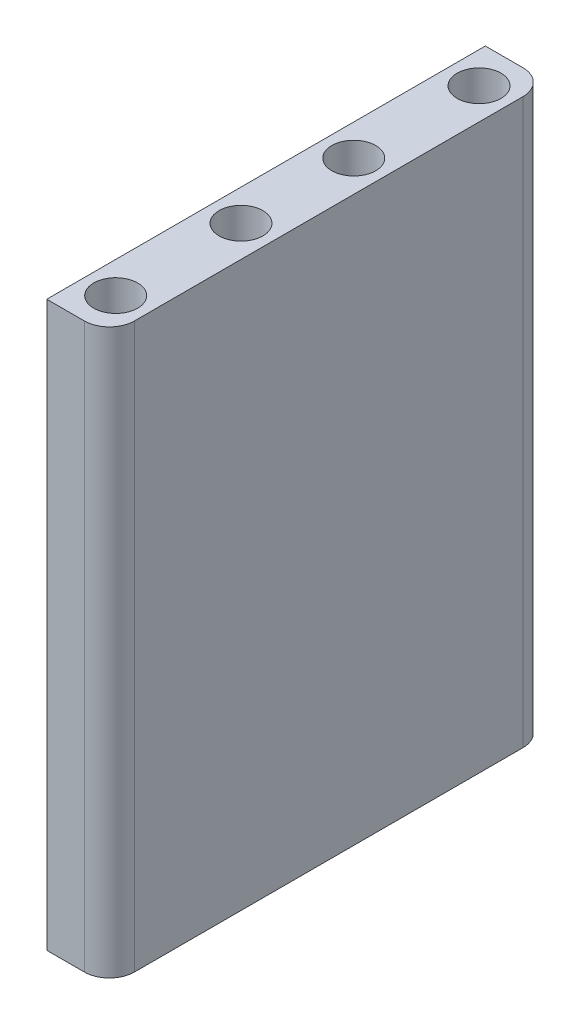
ISO-10303-21;
HEADER;
FILE_DESCRIPTION(('STEP AP214'),'2;1');
FILE_NAME('part.step','',(''),(''),'','','');
FILE_SCHEMA(('AUTOMOTIVE_DESIGN { 1 0 10303 214 1 1 1 1 }'));
ENDSEC;
DATA;
#1=APPLICATION_CONTEXT('core data for automotive mechanical design processes');
#2=APPLICATION_PROTOCOL_DEFINITION('international standard','automotive_design',2000,#1);
#3=PRODUCT_CONTEXT('',#1,'mechanical');
#4=PRODUCT('Part','Part','',(#3));
#5=PRODUCT_RELATED_PRODUCT_CATEGORY('part','',(#4));
#6=PRODUCT_DEFINITION_FORMATION('','',#4);
#7=PRODUCT_DEFINITION_CONTEXT('part definition',#1,'design');
#8=PRODUCT_DEFINITION('design','',#6,#7);
#9=PRODUCT_DEFINITION_SHAPE('','',#8);
#10=(LENGTH_UNIT() NAMED_UNIT(*) SI_UNIT(.MILLI.,.METRE.));
#11=(NAMED_UNIT(*) PLANE_ANGLE_UNIT() SI_UNIT($,.RADIAN.));
#12=(NAMED_UNIT(*) SI_UNIT($,.STERADIAN.) SOLID_ANGLE_UNIT());
#13=UNCERTAINTY_MEASURE_WITH_UNIT(LENGTH_MEASURE(1.E-05),#10,'distance_accuracy_value','');
#14=(GEOMETRIC_REPRESENTATION_CONTEXT(3) GLOBAL_UNCERTAINTY_ASSIGNED_CONTEXT((#13)) GLOBAL_UNIT_ASSIGNED_CONTEXT((#10,
#11,#12)) REPRESENTATION_CONTEXT('',''));
#15=CARTESIAN_POINT('',(0.,0.,0.));
#16=DIRECTION('',(0.,0.,1.));
#17=DIRECTION('',(1.,0.,0.));
#18=AXIS2_PLACEMENT_3D('',#15,#16,#17);
#19=CARTESIAN_POINT('',(3.,45.,-2.));
#20=DIRECTION('',(0.,1.,0.));
#21=DIRECTION('',(0.,0.,1.));
#22=AXIS2_PLACEMENT_3D('',#19,#20,#21);
#23=PLANE('',#22);
#24=CARTESIAN_POINT('',(2.5,45.,-13.));
#25=DIRECTION('',(0.,1.,0.));
#26=DIRECTION('',(0.,0.,1.));
#27=AXIS2_PLACEMENT_3D('',#24,#25,#26);
#28=CIRCLE('',#27,1.75);
#29=CARTESIAN_POINT('',(2.5,45.,-14.75));
#30=VERTEX_POINT('',#29);
#31=EDGE_CURVE('E189',#30,#30,#28,.T.);
#32=ORIENTED_EDGE('',*,*,#31,.F.);
#33=EDGE_LOOP('',(#32));
#34=FACE_BOUND('',#33,.T.);
#35=CARTESIAN_POINT('',(2.5,45.,-32.));
#36=DIRECTION('',(0.,1.,0.));
#37=DIRECTION('',(0.,0.,1.));
#38=AXIS2_PLACEMENT_3D('',#35,#36,#37);
#39=CIRCLE('',#38,1.75);
#40=CARTESIAN_POINT('',(2.5,45.,-33.75));
#41=VERTEX_POINT('',#40);
#42=EDGE_CURVE('E122',#41,#41,#39,.T.);
#43=ORIENTED_EDGE('',*,*,#42,.F.);
#44=EDGE_LOOP('',(#43));
#45=FACE_BOUND('',#44,.T.);
#46=DIRECTION('',(0.,0.,1.));
#47=VECTOR('',#46,1.);
#48=CARTESIAN_POINT('',(0.,45.,-35.));
#49=LINE('',#48,#47);
#50=CARTESIAN_POINT('',(0.,45.,-35.));
#51=VERTEX_POINT('',#50);
#52=CARTESIAN_POINT('',(0.,45.,0.));
#53=VERTEX_POINT('',#52);
#54=EDGE_CURVE('E129',#51,#53,#49,.T.);
#55=ORIENTED_EDGE('',*,*,#54,.T.);
#56=DIRECTION('',(1.,0.,0.));
#57=VECTOR('',#56,1.);
#58=CARTESIAN_POINT('',(0.,45.,0.));
#59=LINE('',#58,#57);
#60=CARTESIAN_POINT('',(2.99999999999998,45.,0.));
#61=VERTEX_POINT('',#60);
#62=EDGE_CURVE('E87',#53,#61,#59,.T.);
#63=ORIENTED_EDGE('',*,*,#62,.T.);
#64=CARTESIAN_POINT('',(3.,45.,-2.));
#65=DIRECTION('',(0.,1.,0.));
#66=DIRECTION('',(0.,0.,1.));
#67=AXIS2_PLACEMENT_3D('',#64,#65,#66);
#68=CIRCLE('',#67,2.);
#69=CARTESIAN_POINT('',(5.,45.,-2.00000000000001));
#70=VERTEX_POINT('',#69);
#71=EDGE_CURVE('E100',#61,#70,#68,.T.);
#72=ORIENTED_EDGE('',*,*,#71,.T.);
#73=DIRECTION('',(0.,0.,-1.));
#74=VECTOR('',#73,1.);
#75=CARTESIAN_POINT('',(4.99999999999999,45.,-33.));
#76=LINE('',#75,#74);
#77=CARTESIAN_POINT('',(5.,45.,-33.));
#78=VERTEX_POINT('',#77);
#79=EDGE_CURVE('E94',#70,#78,#76,.T.);
#80=ORIENTED_EDGE('',*,*,#79,.T.);
#81=CARTESIAN_POINT('',(2.99999999999999,45.,-33.));
#82=DIRECTION('',(0.,1.,0.));
#83=DIRECTION('',(0.,0.,-1.));
#84=AXIS2_PLACEMENT_3D('',#81,#82,#83);
#85=CIRCLE('',#84,2.);
#86=CARTESIAN_POINT('',(2.99999999999998,45.,-35.));
#87=VERTEX_POINT('',#86);
#88=EDGE_CURVE('E98',#78,#87,#85,.T.);
#89=ORIENTED_EDGE('',*,*,#88,.T.);
#90=DIRECTION('',(-1.,0.,0.));
#91=VECTOR('',#90,1.);
#92=CARTESIAN_POINT('',(0.,45.,-35.));
#93=LINE('',#92,#91);
#94=EDGE_CURVE('E50',#87,#51,#93,.T.);
#95=ORIENTED_EDGE('',*,*,#94,.T.);
#96=EDGE_LOOP('',(#55,#63,#72,#80,#89,#95));
#97=FACE_BOUND('',#96,.T.);
#98=CARTESIAN_POINT('',(2.5,45.,-22.));
#99=DIRECTION('',(0.,1.,0.));
#100=DIRECTION('',(0.,0.,1.));
#101=AXIS2_PLACEMENT_3D('',#98,#99,#100);
#102=CIRCLE('',#101,1.75);
#103=CARTESIAN_POINT('',(2.5,45.,-23.75));
#104=VERTEX_POINT('',#103);
#105=EDGE_CURVE('E195',#104,#104,#102,.T.);
#106=ORIENTED_EDGE('',*,*,#105,.F.);
#107=EDGE_LOOP('',(#106));
#108=FACE_BOUND('',#107,.T.);
#109=CARTESIAN_POINT('',(2.5,45.,-3.));
#110=DIRECTION('',(0.,1.,0.));
#111=DIRECTION('',(0.,0.,1.));
#112=AXIS2_PLACEMENT_3D('',#109,#110,#111);
#113=CIRCLE('',#112,1.75);
#114=CARTESIAN_POINT('',(2.5,45.,-4.75));
#115=VERTEX_POINT('',#114);
#116=EDGE_CURVE('E180',#115,#115,#113,.T.);
#117=ORIENTED_EDGE('',*,*,#116,.F.);
#118=EDGE_LOOP('',(#117));
#119=FACE_BOUND('',#118,.T.);
#120=ADVANCED_FACE('F33',(#34,#45,#97,#108,#119),#23,.T.);
#121=CARTESIAN_POINT('',(3.,0.,-2.));
#122=DIRECTION('',(0.,1.,0.));
#123=DIRECTION('',(0.,0.,1.));
#124=AXIS2_PLACEMENT_3D('',#121,#122,#123);
#125=PLANE('',#124);
#126=DIRECTION('',(0.,0.,1.));
#127=VECTOR('',#126,1.);
#128=CARTESIAN_POINT('',(0.,0.,-35.));
#129=LINE('',#128,#127);
#130=CARTESIAN_POINT('',(0.,0.,-35.));
#131=VERTEX_POINT('',#130);
#132=CARTESIAN_POINT('',(0.,0.,0.));
#133=VERTEX_POINT('',#132);
#134=EDGE_CURVE('E118',#131,#133,#129,.T.);
#135=ORIENTED_EDGE('',*,*,#134,.F.);
#136=DIRECTION('',(-1.,0.,0.));
#137=VECTOR('',#136,1.);
#138=CARTESIAN_POINT('',(0.,0.,-35.));
#139=LINE('',#138,#137);
#140=CARTESIAN_POINT('',(2.99999999999998,0.,-35.));
#141=VERTEX_POINT('',#140);
#142=EDGE_CURVE('E79',#141,#131,#139,.T.);
#143=ORIENTED_EDGE('',*,*,#142,.F.);
#144=CARTESIAN_POINT('',(2.99999999999999,0.,-33.));
#145=DIRECTION('',(0.,1.,0.));
#146=DIRECTION('',(0.,0.,-1.));
#147=AXIS2_PLACEMENT_3D('',#144,#145,#146);
#148=CIRCLE('',#147,2.);
#149=CARTESIAN_POINT('',(5.,0.,-33.));
#150=VERTEX_POINT('',#149);
#151=EDGE_CURVE('E73',#150,#141,#148,.T.);
#152=ORIENTED_EDGE('',*,*,#151,.F.);
#153=DIRECTION('',(0.,0.,-1.));
#154=VECTOR('',#153,1.);
#155=CARTESIAN_POINT('',(4.99999999999999,0.,-33.));
#156=LINE('',#155,#154);
#157=CARTESIAN_POINT('',(5.,0.,-2.00000000000001));
#158=VERTEX_POINT('',#157);
#159=EDGE_CURVE('E108',#158,#150,#156,.T.);
#160=ORIENTED_EDGE('',*,*,#159,.F.);
#161=CARTESIAN_POINT('',(3.,0.,-2.));
#162=DIRECTION('',(0.,1.,0.));
#163=DIRECTION('',(0.,0.,1.));
#164=AXIS2_PLACEMENT_3D('',#161,#162,#163);
#165=CIRCLE('',#164,2.);
#166=CARTESIAN_POINT('',(2.99999999999998,0.,0.));
#167=VERTEX_POINT('',#166);
#168=EDGE_CURVE('E124',#167,#158,#165,.T.);
#169=ORIENTED_EDGE('',*,*,#168,.F.);
#170=DIRECTION('',(1.,0.,0.));
#171=VECTOR('',#170,1.);
#172=CARTESIAN_POINT('',(0.,0.,0.));
#173=LINE('',#172,#171);
#174=EDGE_CURVE('E121',#133,#167,#173,.T.);
#175=ORIENTED_EDGE('',*,*,#174,.F.);
#176=EDGE_LOOP('',(#135,#143,#152,#160,#169,#175));
#177=FACE_BOUND('',#176,.T.);
#178=CARTESIAN_POINT('',(2.5,0.,-32.));
#179=DIRECTION('',(0.,1.,0.));
#180=DIRECTION('',(0.,0.,1.));
#181=AXIS2_PLACEMENT_3D('',#178,#179,#180);
#182=CIRCLE('',#181,1.75);
#183=CARTESIAN_POINT('',(2.5,0.,-33.75));
#184=VERTEX_POINT('',#183);
#185=EDGE_CURVE('E198',#184,#184,#182,.T.);
#186=ORIENTED_EDGE('',*,*,#185,.T.);
#187=EDGE_LOOP('',(#186));
#188=FACE_BOUND('',#187,.T.);
#189=CARTESIAN_POINT('',(2.5,0.,-22.));
#190=DIRECTION('',(0.,1.,0.));
#191=DIRECTION('',(0.,0.,1.));
#192=AXIS2_PLACEMENT_3D('',#189,#190,#191);
#193=CIRCLE('',#192,1.75);
#194=CARTESIAN_POINT('',(2.5,0.,-23.75));
#195=VERTEX_POINT('',#194);
#196=EDGE_CURVE('E192',#195,#195,#193,.T.);
#197=ORIENTED_EDGE('',*,*,#196,.T.);
#198=EDGE_LOOP('',(#197));
#199=FACE_BOUND('',#198,.T.);
#200=CARTESIAN_POINT('',(2.5,0.,-13.));
#201=DIRECTION('',(0.,1.,0.));
#202=DIRECTION('',(0.,0.,1.));
#203=AXIS2_PLACEMENT_3D('',#200,#201,#202);
#204=CIRCLE('',#203,1.75);
#205=CARTESIAN_POINT('',(2.5,0.,-14.75));
#206=VERTEX_POINT('',#205);
#207=EDGE_CURVE('E186',#206,#206,#204,.T.);
#208=ORIENTED_EDGE('',*,*,#207,.T.);
#209=EDGE_LOOP('',(#208));
#210=FACE_BOUND('',#209,.T.);
#211=CARTESIAN_POINT('',(2.5,0.,-3.));
#212=DIRECTION('',(0.,1.,0.));
#213=DIRECTION('',(0.,0.,1.));
#214=AXIS2_PLACEMENT_3D('',#211,#212,#213);
#215=CIRCLE('',#214,1.75);
#216=CARTESIAN_POINT('',(2.5,0.,-4.75));
#217=VERTEX_POINT('',#216);
#218=EDGE_CURVE('E183',#217,#217,#215,.T.);
#219=ORIENTED_EDGE('',*,*,#218,.T.);
#220=EDGE_LOOP('',(#219));
#221=FACE_BOUND('',#220,.T.);
#222=ADVANCED_FACE('F138',(#177,#188,#199,#210,#221),#125,.F.);
#223=CARTESIAN_POINT('',(0.,45.,-35.));
#224=DIRECTION('',(1.,0.,0.));
#225=DIRECTION('',(0.,0.,-1.));
#226=AXIS2_PLACEMENT_3D('',#223,#224,#225);
#227=PLANE('',#226);
#228=ORIENTED_EDGE('',*,*,#134,.T.);
#229=DIRECTION('',(0.,-1.,0.));
#230=VECTOR('',#229,1.);
#231=CARTESIAN_POINT('',(0.,45.,0.));
#232=LINE('',#231,#230);
#233=EDGE_CURVE('E11',#53,#133,#232,.T.);
#234=ORIENTED_EDGE('',*,*,#233,.F.);
#235=ORIENTED_EDGE('',*,*,#54,.F.);
#236=DIRECTION('',(0.,-1.,0.));
#237=VECTOR('',#236,1.);
#238=CARTESIAN_POINT('',(0.,45.,-35.));
#239=LINE('',#238,#237);
#240=EDGE_CURVE('E114',#51,#131,#239,.T.);
#241=ORIENTED_EDGE('',*,*,#240,.T.);
#242=EDGE_LOOP('',(#228,#234,#235,#241));
#243=FACE_BOUND('',#242,.T.);
#244=ADVANCED_FACE('F35',(#243),#227,.F.);
#245=CARTESIAN_POINT('',(0.,45.,0.));
#246=DIRECTION('',(0.,0.,-1.));
#247=DIRECTION('',(-1.,0.,0.));
#248=AXIS2_PLACEMENT_3D('',#245,#246,#247);
#249=PLANE('',#248);
#250=ORIENTED_EDGE('',*,*,#174,.T.);
#251=DIRECTION('',(0.,-1.,0.));
#252=VECTOR('',#251,1.);
#253=CARTESIAN_POINT('',(2.99999999999998,45.,0.));
#254=LINE('',#253,#252);
#255=EDGE_CURVE('E42',#61,#167,#254,.T.);
#256=ORIENTED_EDGE('',*,*,#255,.F.);
#257=ORIENTED_EDGE('',*,*,#62,.F.);
#258=ORIENTED_EDGE('',*,*,#233,.T.);
#259=EDGE_LOOP('',(#250,#256,#257,#258));
#260=FACE_BOUND('',#259,.T.);
#261=ADVANCED_FACE('F256',(#260),#249,.F.);
#262=CARTESIAN_POINT('',(3.,45.,-2.));
#263=DIRECTION('',(0.,-1.,0.));
#264=DIRECTION('',(0.,0.,-1.));
#265=AXIS2_PLACEMENT_3D('',#262,#263,#264);
#266=CYLINDRICAL_SURFACE('',#265,2.);
#267=ORIENTED_EDGE('',*,*,#168,.T.);
#268=DIRECTION('',(0.,-1.,0.));
#269=VECTOR('',#268,1.);
#270=CARTESIAN_POINT('',(5.,45.,-2.00000000000001));
#271=LINE('',#270,#269);
#272=EDGE_CURVE('E109',#70,#158,#271,.T.);
#273=ORIENTED_EDGE('',*,*,#272,.F.);
#274=ORIENTED_EDGE('',*,*,#71,.F.);
#275=ORIENTED_EDGE('',*,*,#255,.T.);
#276=EDGE_LOOP('',(#267,#273,#274,#275));
#277=FACE_BOUND('',#276,.T.);
#278=ADVANCED_FACE('F135',(#277),#266,.T.);
#279=CARTESIAN_POINT('',(4.99999999999999,45.,-33.));
#280=DIRECTION('',(-1.,0.,0.));
#281=DIRECTION('',(0.,0.,1.));
#282=AXIS2_PLACEMENT_3D('',#279,#280,#281);
#283=PLANE('',#282);
#284=ORIENTED_EDGE('',*,*,#159,.T.);
#285=DIRECTION('',(0.,-1.,0.));
#286=VECTOR('',#285,1.);
#287=CARTESIAN_POINT('',(5.,45.,-33.));
#288=LINE('',#287,#286);
#289=EDGE_CURVE('E105',#78,#150,#288,.T.);
#290=ORIENTED_EDGE('',*,*,#289,.F.);
#291=ORIENTED_EDGE('',*,*,#79,.F.);
#292=ORIENTED_EDGE('',*,*,#272,.T.);
#293=EDGE_LOOP('',(#284,#290,#291,#292));
#294=FACE_BOUND('',#293,.T.);
#295=ADVANCED_FACE('F106',(#294),#283,.F.);
#296=CARTESIAN_POINT('',(2.99999999999999,45.,-33.));
#297=DIRECTION('',(0.,-1.,0.));
#298=DIRECTION('',(0.,0.,-1.));
#299=AXIS2_PLACEMENT_3D('',#296,#297,#298);
#300=CYLINDRICAL_SURFACE('',#299,2.);
#301=ORIENTED_EDGE('',*,*,#151,.T.);
#302=DIRECTION('',(0.,-1.,0.));
#303=VECTOR('',#302,1.);
#304=CARTESIAN_POINT('',(2.99999999999998,45.,-35.));
#305=LINE('',#304,#303);
#306=EDGE_CURVE('E110',#87,#141,#305,.T.);
#307=ORIENTED_EDGE('',*,*,#306,.F.);
#308=ORIENTED_EDGE('',*,*,#88,.F.);
#309=ORIENTED_EDGE('',*,*,#289,.T.);
#310=EDGE_LOOP('',(#301,#307,#308,#309));
#311=FACE_BOUND('',#310,.T.);
#312=ADVANCED_FACE('F112',(#311),#300,.T.);
#313=CARTESIAN_POINT('',(0.,45.,-35.));
#314=DIRECTION('',(0.,0.,1.));
#315=DIRECTION('',(1.,0.,0.));
#316=AXIS2_PLACEMENT_3D('',#313,#314,#315);
#317=PLANE('',#316);
#318=ORIENTED_EDGE('',*,*,#142,.T.);
#319=ORIENTED_EDGE('',*,*,#240,.F.);
#320=ORIENTED_EDGE('',*,*,#94,.F.);
#321=ORIENTED_EDGE('',*,*,#306,.T.);
#322=EDGE_LOOP('',(#318,#319,#320,#321));
#323=FACE_BOUND('',#322,.T.);
#324=ADVANCED_FACE('F143',(#323),#317,.F.);
#325=CARTESIAN_POINT('',(2.5,45.,-32.));
#326=DIRECTION('',(0.,-1.,0.));
#327=DIRECTION('',(0.,0.,-1.));
#328=AXIS2_PLACEMENT_3D('',#325,#326,#327);
#329=CYLINDRICAL_SURFACE('',#328,1.75);
#330=CARTESIAN_POINT('',(2.5,45.,-33.75));
#331=CARTESIAN_POINT('',(2.5,44.53125,-33.75));
#332=CARTESIAN_POINT('',(2.5,44.0625,-33.75));
#333=CARTESIAN_POINT('',(2.5,43.125,-33.75));
#334=CARTESIAN_POINT('',(2.5,42.65625,-33.75));
#335=CARTESIAN_POINT('',(2.5,41.71875,-33.75));
#336=CARTESIAN_POINT('',(2.5,41.25,-33.75));
#337=CARTESIAN_POINT('',(2.5,40.3125,-33.75));
#338=CARTESIAN_POINT('',(2.5,39.84375,-33.75));
#339=CARTESIAN_POINT('',(2.5,38.90625,-33.75));
#340=CARTESIAN_POINT('',(2.5,38.4375,-33.75));
#341=CARTESIAN_POINT('',(2.5,37.5,-33.75));
#342=CARTESIAN_POINT('',(2.5,37.03125,-33.75));
#343=CARTESIAN_POINT('',(2.5,36.09375,-33.75));
#344=CARTESIAN_POINT('',(2.5,35.625,-33.75));
#345=CARTESIAN_POINT('',(2.5,34.6875,-33.75));
#346=CARTESIAN_POINT('',(2.5,34.21875,-33.75));
#347=CARTESIAN_POINT('',(2.5,33.28125,-33.75));
#348=CARTESIAN_POINT('',(2.5,32.8125,-33.75));
#349=CARTESIAN_POINT('',(2.5,31.875,-33.75));
#350=CARTESIAN_POINT('',(2.5,31.40625,-33.75));
#351=CARTESIAN_POINT('',(2.5,30.46875,-33.75));
#352=CARTESIAN_POINT('',(2.5,30.,-33.75));
#353=CARTESIAN_POINT('',(2.5,29.0625,-33.75));
#354=CARTESIAN_POINT('',(2.5,28.59375,-33.75));
#355=CARTESIAN_POINT('',(2.5,27.65625,-33.75));
#356=CARTESIAN_POINT('',(2.5,27.1875,-33.75));
#357=CARTESIAN_POINT('',(2.5,26.25,-33.75));
#358=CARTESIAN_POINT('',(2.5,25.78125,-33.75));
#359=CARTESIAN_POINT('',(2.5,24.84375,-33.75));
#360=CARTESIAN_POINT('',(2.5,24.375,-33.75));
#361=CARTESIAN_POINT('',(2.5,23.4375,-33.75));
#362=CARTESIAN_POINT('',(2.5,22.96875,-33.75));
#363=CARTESIAN_POINT('',(2.5,22.03125,-33.75));
#364=CARTESIAN_POINT('',(2.5,21.5625,-33.75));
#365=CARTESIAN_POINT('',(2.5,20.625,-33.75));
#366=CARTESIAN_POINT('',(2.5,20.15625,-33.75));
#367=CARTESIAN_POINT('',(2.5,19.21875,-33.75));
#368=CARTESIAN_POINT('',(2.5,18.75,-33.75));
#369=CARTESIAN_POINT('',(2.5,17.8125,-33.75));
#370=CARTESIAN_POINT('',(2.5,17.34375,-33.75));
#371=CARTESIAN_POINT('',(2.5,16.40625,-33.75));
#372=CARTESIAN_POINT('',(2.5,15.9375,-33.75));
#373=CARTESIAN_POINT('',(2.5,15.,-33.75));
#374=CARTESIAN_POINT('',(2.5,14.53125,-33.75));
#375=CARTESIAN_POINT('',(2.5,13.59375,-33.75));
#376=CARTESIAN_POINT('',(2.5,13.125,-33.75));
#377=CARTESIAN_POINT('',(2.5,12.1875,-33.75));
#378=CARTESIAN_POINT('',(2.5,11.71875,-33.75));
#379=CARTESIAN_POINT('',(2.5,10.78125,-33.75));
#380=CARTESIAN_POINT('',(2.5,10.3125,-33.75));
#381=CARTESIAN_POINT('',(2.5,9.37499999999999,-33.75));
#382=CARTESIAN_POINT('',(2.5,8.90624999999999,-33.75));
#383=CARTESIAN_POINT('',(2.5,7.96874999999999,-33.75));
#384=CARTESIAN_POINT('',(2.5,7.5,-33.75));
#385=CARTESIAN_POINT('',(2.5,6.56249999999999,-33.75));
#386=CARTESIAN_POINT('',(2.5,6.09374999999999,-33.75));
#387=CARTESIAN_POINT('',(2.5,5.15624999999999,-33.75));
#388=CARTESIAN_POINT('',(2.5,4.68749999999999,-33.75));
#389=CARTESIAN_POINT('',(2.5,3.74999999999999,-33.75));
#390=CARTESIAN_POINT('',(2.5,3.28124999999999,-33.75));
#391=CARTESIAN_POINT('',(2.5,2.34374999999999,-33.75));
#392=CARTESIAN_POINT('',(2.5,1.87499999999999,-33.75));
#393=CARTESIAN_POINT('',(2.5,0.937499999999992,-33.75));
#394=CARTESIAN_POINT('',(2.5,0.468749999999993,-33.75));
#395=CARTESIAN_POINT('',(2.5,0.,-33.75));
#396=B_SPLINE_CURVE_WITH_KNOTS('',3,(#330,#331,#332,#333,#334,#335,#336,#337,#338,#339,#340,
#341,#342,#343,#344,#345,#346,#347,#348,#349,#350,#351,#352,#353,#354,#355,#356,#357,#358,#359,
#360,#361,#362,#363,#364,#365,#366,#367,#368,#369,#370,#371,#372,#373,#374,#375,#376,#377,#378,
#379,#380,#381,#382,#383,#384,#385,#386,#387,#388,#389,#390,#391,#392,#393,#394,#395),
.UNSPECIFIED.,.F.,.F.,(4,2,2,2,2,2,2,2,2,2,2,2,2,2,2,2,2,2,2,2,2,2,2,2,2,2,2,2,2,2,2,2,4),(0.,
1.40625,2.8125,4.21874999999999,5.625,7.03125,8.43749999999999,9.84375,11.25,12.65625,14.0625,
15.46875,16.875,18.28125,19.6875,21.09375,22.5,23.90625,25.3125,26.71875,28.125,29.53125,
30.9375,32.34375,33.75,35.15625,36.5625,37.96875,39.375,40.78125,42.1875,43.59375,45.),.UNSPECIFIED.);
#397=EDGE_CURVE('BSEAM145',#41,#184,#396,.T.);
#398=ORIENTED_EDGE('',*,*,#42,.T.);
#399=ORIENTED_EDGE('',*,*,#185,.F.);
#400=ORIENTED_EDGE('',*,*,#397,.T.);
#401=ORIENTED_EDGE('',*,*,#397,.F.);
#402=EDGE_LOOP('',(#398,#400,#399,#401));
#403=FACE_BOUND('',#402,.T.);
#404=ADVANCED_FACE('F145',(#403),#329,.F.);
#405=CARTESIAN_POINT('',(2.5,45.,-22.));
#406=DIRECTION('',(0.,-1.,0.));
#407=DIRECTION('',(0.,0.,-1.));
#408=AXIS2_PLACEMENT_3D('',#405,#406,#407);
#409=CYLINDRICAL_SURFACE('',#408,1.75);
#410=CARTESIAN_POINT('',(2.5,45.,-23.75));
#411=CARTESIAN_POINT('',(2.5,44.53125,-23.75));
#412=CARTESIAN_POINT('',(2.5,44.0625,-23.75));
#413=CARTESIAN_POINT('',(2.5,43.125,-23.75));
#414=CARTESIAN_POINT('',(2.5,42.65625,-23.75));
#415=CARTESIAN_POINT('',(2.5,41.71875,-23.75));
#416=CARTESIAN_POINT('',(2.5,41.25,-23.75));
#417=CARTESIAN_POINT('',(2.5,40.3125,-23.75));
#418=CARTESIAN_POINT('',(2.5,39.84375,-23.75));
#419=CARTESIAN_POINT('',(2.5,38.90625,-23.75));
#420=CARTESIAN_POINT('',(2.5,38.4375,-23.75));
#421=CARTESIAN_POINT('',(2.5,37.5,-23.75));
#422=CARTESIAN_POINT('',(2.5,37.03125,-23.75));
#423=CARTESIAN_POINT('',(2.5,36.09375,-23.75));
#424=CARTESIAN_POINT('',(2.5,35.625,-23.75));
#425=CARTESIAN_POINT('',(2.5,34.6875,-23.75));
#426=CARTESIAN_POINT('',(2.5,34.21875,-23.75));
#427=CARTESIAN_POINT('',(2.5,33.28125,-23.75));
#428=CARTESIAN_POINT('',(2.5,32.8125,-23.75));
#429=CARTESIAN_POINT('',(2.5,31.875,-23.75));
#430=CARTESIAN_POINT('',(2.5,31.40625,-23.75));
#431=CARTESIAN_POINT('',(2.5,30.46875,-23.75));
#432=CARTESIAN_POINT('',(2.5,30.,-23.75));
#433=CARTESIAN_POINT('',(2.5,29.0625,-23.75));
#434=CARTESIAN_POINT('',(2.5,28.59375,-23.75));
#435=CARTESIAN_POINT('',(2.5,27.65625,-23.75));
#436=CARTESIAN_POINT('',(2.5,27.1875,-23.75));
#437=CARTESIAN_POINT('',(2.5,26.25,-23.75));
#438=CARTESIAN_POINT('',(2.5,25.78125,-23.75));
#439=CARTESIAN_POINT('',(2.5,24.84375,-23.75));
#440=CARTESIAN_POINT('',(2.5,24.375,-23.75));
#441=CARTESIAN_POINT('',(2.5,23.4375,-23.75));
#442=CARTESIAN_POINT('',(2.5,22.96875,-23.75));
#443=CARTESIAN_POINT('',(2.5,22.03125,-23.75));
#444=CARTESIAN_POINT('',(2.5,21.5625,-23.75));
#445=CARTESIAN_POINT('',(2.5,20.625,-23.75));
#446=CARTESIAN_POINT('',(2.5,20.15625,-23.75));
#447=CARTESIAN_POINT('',(2.5,19.21875,-23.75));
#448=CARTESIAN_POINT('',(2.5,18.75,-23.75));
#449=CARTESIAN_POINT('',(2.5,17.8125,-23.75));
#450=CARTESIAN_POINT('',(2.5,17.34375,-23.75));
#451=CARTESIAN_POINT('',(2.5,16.40625,-23.75));
#452=CARTESIAN_POINT('',(2.5,15.9375,-23.75));
#453=CARTESIAN_POINT('',(2.5,15.,-23.75));
#454=CARTESIAN_POINT('',(2.5,14.53125,-23.75));
#455=CARTESIAN_POINT('',(2.5,13.59375,-23.75));
#456=CARTESIAN_POINT('',(2.5,13.125,-23.75));
#457=CARTESIAN_POINT('',(2.5,12.1875,-23.75));
#458=CARTESIAN_POINT('',(2.5,11.71875,-23.75));
#459=CARTESIAN_POINT('',(2.5,10.78125,-23.75));
#460=CARTESIAN_POINT('',(2.5,10.3125,-23.75));
#461=CARTESIAN_POINT('',(2.5,9.37499999999999,-23.75));
#462=CARTESIAN_POINT('',(2.5,8.90624999999999,-23.75));
#463=CARTESIAN_POINT('',(2.5,7.96874999999999,-23.75));
#464=CARTESIAN_POINT('',(2.5,7.5,-23.75));
#465=CARTESIAN_POINT('',(2.5,6.56249999999999,-23.75));
#466=CARTESIAN_POINT('',(2.5,6.09374999999999,-23.75));
#467=CARTESIAN_POINT('',(2.5,5.15624999999999,-23.75));
#468=CARTESIAN_POINT('',(2.5,4.68749999999999,-23.75));
#469=CARTESIAN_POINT('',(2.5,3.74999999999999,-23.75));
#470=CARTESIAN_POINT('',(2.5,3.28124999999999,-23.75));
#471=CARTESIAN_POINT('',(2.5,2.34374999999999,-23.75));
#472=CARTESIAN_POINT('',(2.5,1.87499999999999,-23.75));
#473=CARTESIAN_POINT('',(2.5,0.937499999999992,-23.75));
#474=CARTESIAN_POINT('',(2.5,0.468749999999993,-23.75));
#475=CARTESIAN_POINT('',(2.5,0.,-23.75));
#476=B_SPLINE_CURVE_WITH_KNOTS('',3,(#410,#411,#412,#413,#414,#415,#416,#417,#418,#419,#420,
#421,#422,#423,#424,#425,#426,#427,#428,#429,#430,#431,#432,#433,#434,#435,#436,#437,#438,#439,
#440,#441,#442,#443,#444,#445,#446,#447,#448,#449,#450,#451,#452,#453,#454,#455,#456,#457,#458,
#459,#460,#461,#462,#463,#464,#465,#466,#467,#468,#469,#470,#471,#472,#473,#474,#475),
.UNSPECIFIED.,.F.,.F.,(4,2,2,2,2,2,2,2,2,2,2,2,2,2,2,2,2,2,2,2,2,2,2,2,2,2,2,2,2,2,2,2,4),(0.,
1.40625,2.8125,4.21874999999999,5.625,7.03125,8.43749999999999,9.84375,11.25,12.65625,14.0625,
15.46875,16.875,18.28125,19.6875,21.09375,22.5,23.90625,25.3125,26.71875,28.125,29.53125,
30.9375,32.34375,33.75,35.15625,36.5625,37.96875,39.375,40.78125,42.1875,43.59375,45.),.UNSPECIFIED.);
#477=EDGE_CURVE('BSEAM151',#104,#195,#476,.T.);
#478=ORIENTED_EDGE('',*,*,#105,.T.);
#479=ORIENTED_EDGE('',*,*,#196,.F.);
#480=ORIENTED_EDGE('',*,*,#477,.T.);
#481=ORIENTED_EDGE('',*,*,#477,.F.);
#482=EDGE_LOOP('',(#478,#480,#479,#481));
#483=FACE_BOUND('',#482,.T.);
#484=ADVANCED_FACE('F151',(#483),#409,.F.);
#485=CARTESIAN_POINT('',(2.5,45.,-13.));
#486=DIRECTION('',(0.,-1.,0.));
#487=DIRECTION('',(0.,0.,-1.));
#488=AXIS2_PLACEMENT_3D('',#485,#486,#487);
#489=CYLINDRICAL_SURFACE('',#488,1.75);
#490=CARTESIAN_POINT('',(2.5,45.,-14.75));
#491=CARTESIAN_POINT('',(2.5,44.53125,-14.75));
#492=CARTESIAN_POINT('',(2.5,44.0625,-14.75));
#493=CARTESIAN_POINT('',(2.5,43.125,-14.75));
#494=CARTESIAN_POINT('',(2.5,42.65625,-14.75));
#495=CARTESIAN_POINT('',(2.5,41.71875,-14.75));
#496=CARTESIAN_POINT('',(2.5,41.25,-14.75));
#497=CARTESIAN_POINT('',(2.5,40.3125,-14.75));
#498=CARTESIAN_POINT('',(2.5,39.84375,-14.75));
#499=CARTESIAN_POINT('',(2.5,38.90625,-14.75));
#500=CARTESIAN_POINT('',(2.5,38.4375,-14.75));
#501=CARTESIAN_POINT('',(2.5,37.5,-14.75));
#502=CARTESIAN_POINT('',(2.5,37.03125,-14.75));
#503=CARTESIAN_POINT('',(2.5,36.09375,-14.75));
#504=CARTESIAN_POINT('',(2.5,35.625,-14.75));
#505=CARTESIAN_POINT('',(2.5,34.6875,-14.75));
#506=CARTESIAN_POINT('',(2.5,34.21875,-14.75));
#507=CARTESIAN_POINT('',(2.5,33.28125,-14.75));
#508=CARTESIAN_POINT('',(2.5,32.8125,-14.75));
#509=CARTESIAN_POINT('',(2.5,31.875,-14.75));
#510=CARTESIAN_POINT('',(2.5,31.40625,-14.75));
#511=CARTESIAN_POINT('',(2.5,30.46875,-14.75));
#512=CARTESIAN_POINT('',(2.5,30.,-14.75));
#513=CARTESIAN_POINT('',(2.5,29.0625,-14.75));
#514=CARTESIAN_POINT('',(2.5,28.59375,-14.75));
#515=CARTESIAN_POINT('',(2.5,27.65625,-14.75));
#516=CARTESIAN_POINT('',(2.5,27.1875,-14.75));
#517=CARTESIAN_POINT('',(2.5,26.25,-14.75));
#518=CARTESIAN_POINT('',(2.5,25.78125,-14.75));
#519=CARTESIAN_POINT('',(2.5,24.84375,-14.75));
#520=CARTESIAN_POINT('',(2.5,24.375,-14.75));
#521=CARTESIAN_POINT('',(2.5,23.4375,-14.75));
#522=CARTESIAN_POINT('',(2.5,22.96875,-14.75));
#523=CARTESIAN_POINT('',(2.5,22.03125,-14.75));
#524=CARTESIAN_POINT('',(2.5,21.5625,-14.75));
#525=CARTESIAN_POINT('',(2.5,20.625,-14.75));
#526=CARTESIAN_POINT('',(2.5,20.15625,-14.75));
#527=CARTESIAN_POINT('',(2.5,19.21875,-14.75));
#528=CARTESIAN_POINT('',(2.5,18.75,-14.75));
#529=CARTESIAN_POINT('',(2.5,17.8125,-14.75));
#530=CARTESIAN_POINT('',(2.5,17.34375,-14.75));
#531=CARTESIAN_POINT('',(2.5,16.40625,-14.75));
#532=CARTESIAN_POINT('',(2.5,15.9375,-14.75));
#533=CARTESIAN_POINT('',(2.5,15.,-14.75));
#534=CARTESIAN_POINT('',(2.5,14.53125,-14.75));
#535=CARTESIAN_POINT('',(2.5,13.59375,-14.75));
#536=CARTESIAN_POINT('',(2.5,13.125,-14.75));
#537=CARTESIAN_POINT('',(2.5,12.1875,-14.75));
#538=CARTESIAN_POINT('',(2.5,11.71875,-14.75));
#539=CARTESIAN_POINT('',(2.5,10.78125,-14.75));
#540=CARTESIAN_POINT('',(2.5,10.3125,-14.75));
#541=CARTESIAN_POINT('',(2.5,9.37499999999999,-14.75));
#542=CARTESIAN_POINT('',(2.5,8.90624999999999,-14.75));
#543=CARTESIAN_POINT('',(2.5,7.96874999999999,-14.75));
#544=CARTESIAN_POINT('',(2.5,7.5,-14.75));
#545=CARTESIAN_POINT('',(2.5,6.56249999999999,-14.75));
#546=CARTESIAN_POINT('',(2.5,6.09374999999999,-14.75));
#547=CARTESIAN_POINT('',(2.5,5.15624999999999,-14.75));
#548=CARTESIAN_POINT('',(2.5,4.68749999999999,-14.75));
#549=CARTESIAN_POINT('',(2.5,3.74999999999999,-14.75));
#550=CARTESIAN_POINT('',(2.5,3.28124999999999,-14.75));
#551=CARTESIAN_POINT('',(2.5,2.34374999999999,-14.75));
#552=CARTESIAN_POINT('',(2.5,1.87499999999999,-14.75));
#553=CARTESIAN_POINT('',(2.5,0.937499999999992,-14.75));
#554=CARTESIAN_POINT('',(2.5,0.468749999999993,-14.75));
#555=CARTESIAN_POINT('',(2.5,0.,-14.75));
#556=B_SPLINE_CURVE_WITH_KNOTS('',3,(#490,#491,#492,#493,#494,#495,#496,#497,#498,#499,#500,
#501,#502,#503,#504,#505,#506,#507,#508,#509,#510,#511,#512,#513,#514,#515,#516,#517,#518,#519,
#520,#521,#522,#523,#524,#525,#526,#527,#528,#529,#530,#531,#532,#533,#534,#535,#536,#537,#538,
#539,#540,#541,#542,#543,#544,#545,#546,#547,#548,#549,#550,#551,#552,#553,#554,#555),
.UNSPECIFIED.,.F.,.F.,(4,2,2,2,2,2,2,2,2,2,2,2,2,2,2,2,2,2,2,2,2,2,2,2,2,2,2,2,2,2,2,2,4),(0.,
1.40625,2.8125,4.21874999999999,5.625,7.03125,8.43749999999999,9.84375,11.25,12.65625,14.0625,
15.46875,16.875,18.28125,19.6875,21.09375,22.5,23.90625,25.3125,26.71875,28.125,29.53125,
30.9375,32.34375,33.75,35.15625,36.5625,37.96875,39.375,40.78125,42.1875,43.59375,45.),.UNSPECIFIED.);
#557=EDGE_CURVE('BSEAM167',#30,#206,#556,.T.);
#558=ORIENTED_EDGE('',*,*,#31,.T.);
#559=ORIENTED_EDGE('',*,*,#207,.F.);
#560=ORIENTED_EDGE('',*,*,#557,.T.);
#561=ORIENTED_EDGE('',*,*,#557,.F.);
#562=EDGE_LOOP('',(#558,#560,#559,#561));
#563=FACE_BOUND('',#562,.T.);
#564=ADVANCED_FACE('F167',(#563),#489,.F.);
#565=CARTESIAN_POINT('',(2.5,45.,-3.));
#566=DIRECTION('',(0.,-1.,0.));
#567=DIRECTION('',(0.,0.,-1.));
#568=AXIS2_PLACEMENT_3D('',#565,#566,#567);
#569=CYLINDRICAL_SURFACE('',#568,1.75);
#570=CARTESIAN_POINT('',(2.5,45.,-4.75));
#571=CARTESIAN_POINT('',(2.5,44.53125,-4.75));
#572=CARTESIAN_POINT('',(2.5,44.0625,-4.75));
#573=CARTESIAN_POINT('',(2.5,43.125,-4.75));
#574=CARTESIAN_POINT('',(2.5,42.65625,-4.75));
#575=CARTESIAN_POINT('',(2.5,41.71875,-4.75));
#576=CARTESIAN_POINT('',(2.5,41.25,-4.75));
#577=CARTESIAN_POINT('',(2.5,40.3125,-4.75));
#578=CARTESIAN_POINT('',(2.5,39.84375,-4.75));
#579=CARTESIAN_POINT('',(2.5,38.90625,-4.75));
#580=CARTESIAN_POINT('',(2.5,38.4375,-4.75));
#581=CARTESIAN_POINT('',(2.5,37.5,-4.75));
#582=CARTESIAN_POINT('',(2.5,37.03125,-4.75));
#583=CARTESIAN_POINT('',(2.5,36.09375,-4.75));
#584=CARTESIAN_POINT('',(2.5,35.625,-4.75));
#585=CARTESIAN_POINT('',(2.5,34.6875,-4.75));
#586=CARTESIAN_POINT('',(2.5,34.21875,-4.75));
#587=CARTESIAN_POINT('',(2.5,33.28125,-4.75));
#588=CARTESIAN_POINT('',(2.5,32.8125,-4.75));
#589=CARTESIAN_POINT('',(2.5,31.875,-4.75));
#590=CARTESIAN_POINT('',(2.5,31.40625,-4.75));
#591=CARTESIAN_POINT('',(2.5,30.46875,-4.75));
#592=CARTESIAN_POINT('',(2.5,30.,-4.75));
#593=CARTESIAN_POINT('',(2.5,29.0625,-4.75));
#594=CARTESIAN_POINT('',(2.5,28.59375,-4.75));
#595=CARTESIAN_POINT('',(2.5,27.65625,-4.75));
#596=CARTESIAN_POINT('',(2.5,27.1875,-4.75));
#597=CARTESIAN_POINT('',(2.5,26.25,-4.75));
#598=CARTESIAN_POINT('',(2.5,25.78125,-4.75));
#599=CARTESIAN_POINT('',(2.5,24.84375,-4.75));
#600=CARTESIAN_POINT('',(2.5,24.375,-4.75));
#601=CARTESIAN_POINT('',(2.5,23.4375,-4.75));
#602=CARTESIAN_POINT('',(2.5,22.96875,-4.75));
#603=CARTESIAN_POINT('',(2.5,22.03125,-4.75));
#604=CARTESIAN_POINT('',(2.5,21.5625,-4.75));
#605=CARTESIAN_POINT('',(2.5,20.625,-4.75));
#606=CARTESIAN_POINT('',(2.5,20.15625,-4.75));
#607=CARTESIAN_POINT('',(2.5,19.21875,-4.75));
#608=CARTESIAN_POINT('',(2.5,18.75,-4.75));
#609=CARTESIAN_POINT('',(2.5,17.8125,-4.75));
#610=CARTESIAN_POINT('',(2.5,17.34375,-4.75));
#611=CARTESIAN_POINT('',(2.5,16.40625,-4.75));
#612=CARTESIAN_POINT('',(2.5,15.9375,-4.75));
#613=CARTESIAN_POINT('',(2.5,15.,-4.75));
#614=CARTESIAN_POINT('',(2.5,14.53125,-4.75));
#615=CARTESIAN_POINT('',(2.5,13.59375,-4.75));
#616=CARTESIAN_POINT('',(2.5,13.125,-4.75));
#617=CARTESIAN_POINT('',(2.5,12.1875,-4.75));
#618=CARTESIAN_POINT('',(2.5,11.71875,-4.75));
#619=CARTESIAN_POINT('',(2.5,10.78125,-4.75));
#620=CARTESIAN_POINT('',(2.5,10.3125,-4.75));
#621=CARTESIAN_POINT('',(2.5,9.37499999999999,-4.75));
#622=CARTESIAN_POINT('',(2.5,8.90624999999999,-4.75));
#623=CARTESIAN_POINT('',(2.5,7.96874999999999,-4.75));
#624=CARTESIAN_POINT('',(2.5,7.5,-4.75));
#625=CARTESIAN_POINT('',(2.5,6.56249999999999,-4.75));
#626=CARTESIAN_POINT('',(2.5,6.09374999999999,-4.75));
#627=CARTESIAN_POINT('',(2.5,5.15624999999999,-4.75));
#628=CARTESIAN_POINT('',(2.5,4.68749999999999,-4.75));
#629=CARTESIAN_POINT('',(2.5,3.74999999999999,-4.75));
#630=CARTESIAN_POINT('',(2.5,3.28124999999999,-4.75));
#631=CARTESIAN_POINT('',(2.5,2.34374999999999,-4.75));
#632=CARTESIAN_POINT('',(2.5,1.87499999999999,-4.75));
#633=CARTESIAN_POINT('',(2.5,0.937499999999992,-4.75));
#634=CARTESIAN_POINT('',(2.5,0.468749999999993,-4.75));
#635=CARTESIAN_POINT('',(2.5,0.,-4.75));
#636=B_SPLINE_CURVE_WITH_KNOTS('',3,(#570,#571,#572,#573,#574,#575,#576,#577,#578,#579,#580,
#581,#582,#583,#584,#585,#586,#587,#588,#589,#590,#591,#592,#593,#594,#595,#596,#597,#598,#599,
#600,#601,#602,#603,#604,#605,#606,#607,#608,#609,#610,#611,#612,#613,#614,#615,#616,#617,#618,
#619,#620,#621,#622,#623,#624,#625,#626,#627,#628,#629,#630,#631,#632,#633,#634,#635),
.UNSPECIFIED.,.F.,.F.,(4,2,2,2,2,2,2,2,2,2,2,2,2,2,2,2,2,2,2,2,2,2,2,2,2,2,2,2,2,2,2,2,4),(0.,
1.40625,2.8125,4.21874999999999,5.625,7.03125,8.43749999999999,9.84375,11.25,12.65625,14.0625,
15.46875,16.875,18.28125,19.6875,21.09375,22.5,23.90625,25.3125,26.71875,28.125,29.53125,
30.9375,32.34375,33.75,35.15625,36.5625,37.96875,39.375,40.78125,42.1875,43.59375,45.),.UNSPECIFIED.);
#637=EDGE_CURVE('BSEAM171',#115,#217,#636,.T.);
#638=ORIENTED_EDGE('',*,*,#116,.T.);
#639=ORIENTED_EDGE('',*,*,#218,.F.);
#640=ORIENTED_EDGE('',*,*,#637,.T.);
#641=ORIENTED_EDGE('',*,*,#637,.F.);
#642=EDGE_LOOP('',(#638,#640,#639,#641));
#643=FACE_BOUND('',#642,.T.);
#644=ADVANCED_FACE('F171',(#643),#569,.F.);
#645=CLOSED_SHELL('',(#120,#222,#244,#261,#278,#295,#312,#324,#404,#484,#564,#644));
#646=MANIFOLD_SOLID_BREP('B2',#645);
#647=ADVANCED_BREP_SHAPE_REPRESENTATION('',(#18,#646),#14);
#648=SHAPE_DEFINITION_REPRESENTATION(#9,#647);
ENDSEC;
END-ISO-10303-21;
